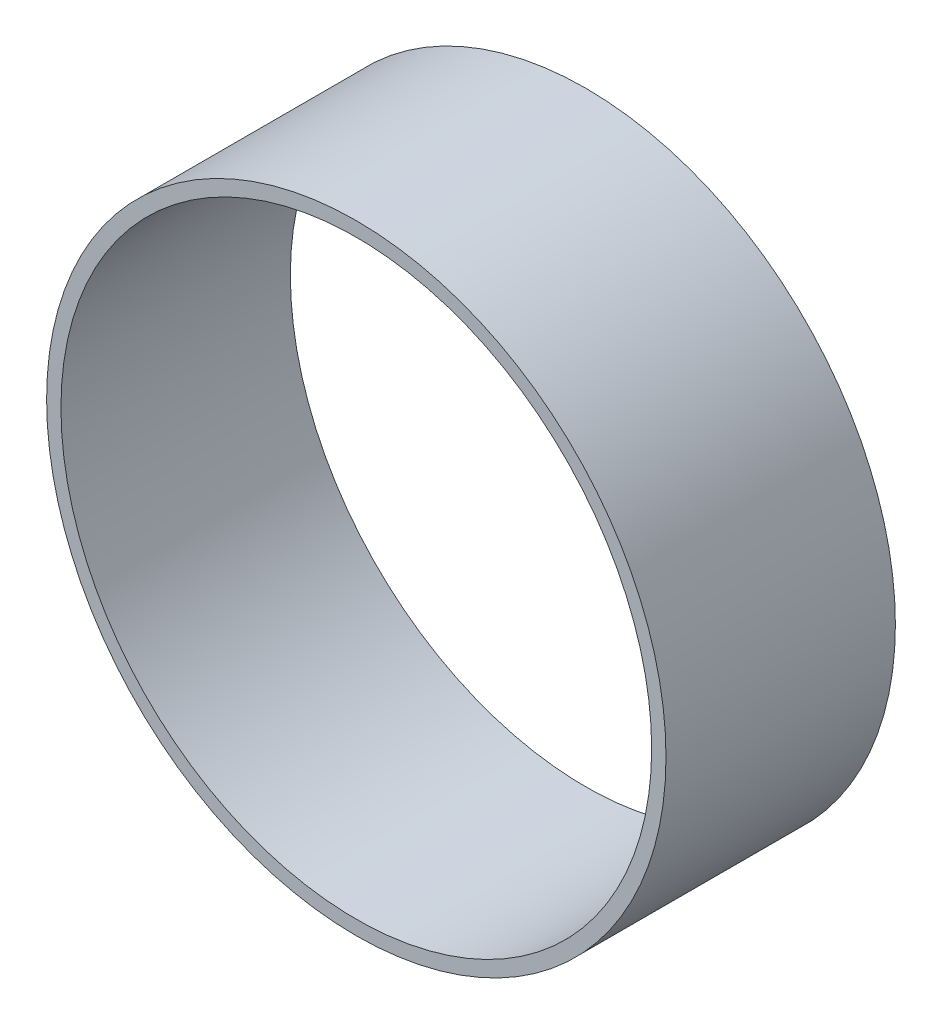
ISO-10303-21;
HEADER;
FILE_DESCRIPTION(('STEP AP214'),'2;1');
FILE_NAME('part.step','',(''),(''),'','','');
FILE_SCHEMA(('AUTOMOTIVE_DESIGN { 1 0 10303 214 1 1 1 1 }'));
ENDSEC;
DATA;
#1=APPLICATION_CONTEXT('core data for automotive mechanical design processes');
#2=APPLICATION_PROTOCOL_DEFINITION('international standard','automotive_design',2000,#1);
#3=PRODUCT_CONTEXT('',#1,'mechanical');
#4=PRODUCT('Part','Part','',(#3));
#5=PRODUCT_RELATED_PRODUCT_CATEGORY('part','',(#4));
#6=PRODUCT_DEFINITION_FORMATION('','',#4);
#7=PRODUCT_DEFINITION_CONTEXT('part definition',#1,'design');
#8=PRODUCT_DEFINITION('design','',#6,#7);
#9=PRODUCT_DEFINITION_SHAPE('','',#8);
#10=(LENGTH_UNIT() NAMED_UNIT(*) SI_UNIT(.MILLI.,.METRE.));
#11=(NAMED_UNIT(*) PLANE_ANGLE_UNIT() SI_UNIT($,.RADIAN.));
#12=(NAMED_UNIT(*) SI_UNIT($,.STERADIAN.) SOLID_ANGLE_UNIT());
#13=UNCERTAINTY_MEASURE_WITH_UNIT(LENGTH_MEASURE(1.E-05),#10,'distance_accuracy_value','');
#14=(GEOMETRIC_REPRESENTATION_CONTEXT(3) GLOBAL_UNCERTAINTY_ASSIGNED_CONTEXT((#13)) GLOBAL_UNIT_ASSIGNED_CONTEXT((#10,
#11,#12)) REPRESENTATION_CONTEXT('',''));
#15=CARTESIAN_POINT('',(0.,0.,0.));
#16=DIRECTION('',(0.,0.,1.));
#17=DIRECTION('',(1.,0.,0.));
#18=AXIS2_PLACEMENT_3D('',#15,#16,#17);
#19=CARTESIAN_POINT('',(0.,0.,20.));
#20=DIRECTION('',(0.,0.,1.));
#21=DIRECTION('',(1.,0.,0.));
#22=AXIS2_PLACEMENT_3D('',#19,#20,#21);
#23=PLANE('',#22);
#24=CARTESIAN_POINT('',(0.,0.,20.));
#25=DIRECTION('',(0.,0.,1.));
#26=DIRECTION('',(1.,0.,0.));
#27=AXIS2_PLACEMENT_3D('',#24,#25,#26);
#28=CIRCLE('',#27,27.);
#29=CARTESIAN_POINT('',(27.,0.,20.));
#30=VERTEX_POINT('',#29);
#31=EDGE_CURVE('E10',#30,#30,#28,.T.);
#32=ORIENTED_EDGE('',*,*,#31,.T.);
#33=EDGE_LOOP('',(#32));
#34=FACE_BOUND('',#33,.T.);
#35=CARTESIAN_POINT('',(0.,0.,20.));
#36=DIRECTION('',(0.,0.,1.));
#37=DIRECTION('',(1.,0.,0.));
#38=AXIS2_PLACEMENT_3D('',#35,#36,#37);
#39=CIRCLE('',#38,25.75);
#40=CARTESIAN_POINT('',(25.75,0.,20.));
#41=VERTEX_POINT('',#40);
#42=EDGE_CURVE('E54',#41,#41,#39,.T.);
#43=ORIENTED_EDGE('',*,*,#42,.F.);
#44=EDGE_LOOP('',(#43));
#45=FACE_BOUND('',#44,.T.);
#46=ADVANCED_FACE('F43',(#34,#45),#23,.T.);
#47=CARTESIAN_POINT('',(0.,0.,0.));
#48=DIRECTION('',(0.,0.,1.));
#49=DIRECTION('',(1.,0.,0.));
#50=AXIS2_PLACEMENT_3D('',#47,#48,#49);
#51=PLANE('',#50);
#52=CARTESIAN_POINT('',(0.,0.,0.));
#53=DIRECTION('',(0.,0.,1.));
#54=DIRECTION('',(1.,0.,0.));
#55=AXIS2_PLACEMENT_3D('',#52,#53,#54);
#56=CIRCLE('',#55,27.);
#57=CARTESIAN_POINT('',(27.,0.,0.));
#58=VERTEX_POINT('',#57);
#59=EDGE_CURVE('E47',#58,#58,#56,.T.);
#60=ORIENTED_EDGE('',*,*,#59,.F.);
#61=EDGE_LOOP('',(#60));
#62=FACE_BOUND('',#61,.T.);
#63=CARTESIAN_POINT('',(0.,0.,0.));
#64=DIRECTION('',(0.,0.,1.));
#65=DIRECTION('',(1.,0.,0.));
#66=AXIS2_PLACEMENT_3D('',#63,#64,#65);
#67=CIRCLE('',#66,25.75);
#68=CARTESIAN_POINT('',(25.75,0.,0.));
#69=VERTEX_POINT('',#68);
#70=EDGE_CURVE('E56',#69,#69,#67,.T.);
#71=ORIENTED_EDGE('',*,*,#70,.T.);
#72=EDGE_LOOP('',(#71));
#73=FACE_BOUND('',#72,.T.);
#74=ADVANCED_FACE('F66',(#62,#73),#51,.F.);
#75=CARTESIAN_POINT('',(0.,0.,20.));
#76=DIRECTION('',(0.,0.,-1.));
#77=DIRECTION('',(-1.,0.,0.));
#78=AXIS2_PLACEMENT_3D('',#75,#76,#77);
#79=CYLINDRICAL_SURFACE('',#78,27.);
#80=ORIENTED_EDGE('',*,*,#31,.F.);
#81=EDGE_LOOP('',(#80));
#82=FACE_BOUND('',#81,.T.);
#83=ORIENTED_EDGE('',*,*,#59,.T.);
#84=EDGE_LOOP('',(#83));
#85=FACE_BOUND('',#84,.T.);
#86=ADVANCED_FACE('F45',(#82,#85),#79,.T.);
#87=CARTESIAN_POINT('',(0.,0.,20.));
#88=DIRECTION('',(0.,0.,-1.));
#89=DIRECTION('',(-1.,0.,0.));
#90=AXIS2_PLACEMENT_3D('',#87,#88,#89);
#91=CYLINDRICAL_SURFACE('',#90,25.75);
#92=ORIENTED_EDGE('',*,*,#42,.T.);
#93=EDGE_LOOP('',(#92));
#94=FACE_BOUND('',#93,.T.);
#95=ORIENTED_EDGE('',*,*,#70,.F.);
#96=EDGE_LOOP('',(#95));
#97=FACE_BOUND('',#96,.T.);
#98=ADVANCED_FACE('F62',(#94,#97),#91,.F.);
#99=CLOSED_SHELL('',(#46,#74,#86,#98));
#100=MANIFOLD_SOLID_BREP('B2',#99);
#101=ADVANCED_BREP_SHAPE_REPRESENTATION('',(#18,#100),#14);
#102=SHAPE_DEFINITION_REPRESENTATION(#9,#101);
ENDSEC;
END-ISO-10303-21;
